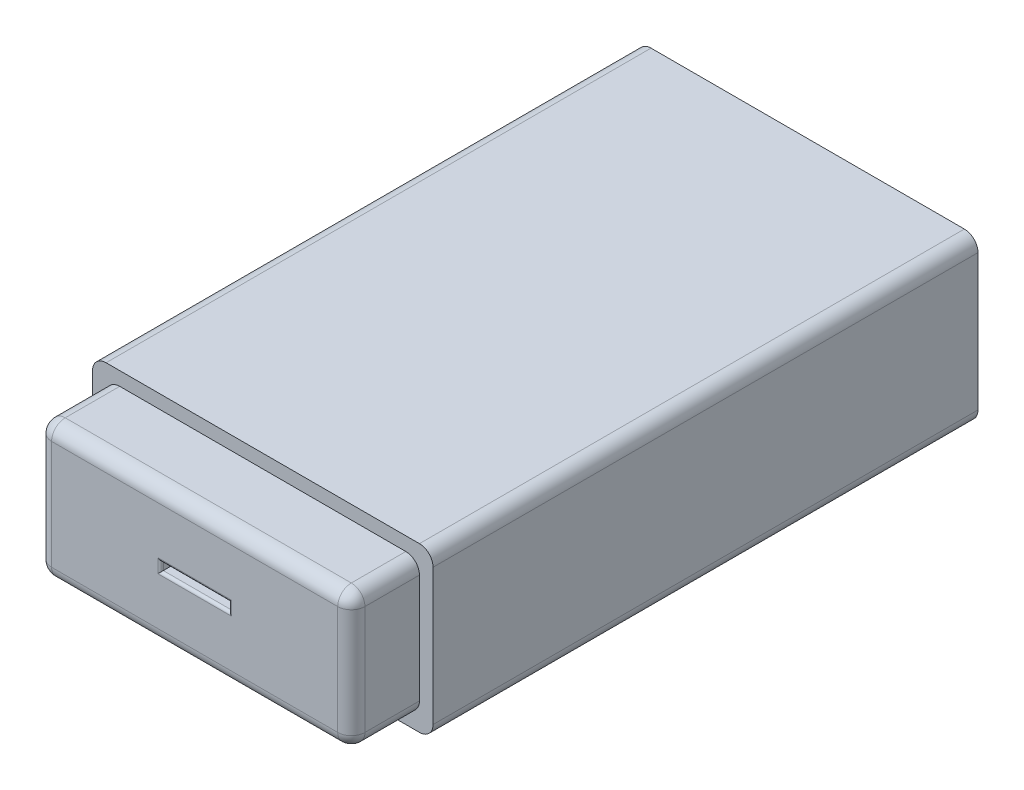
ISO-10303-21;
HEADER;
FILE_DESCRIPTION(('STEP AP214'),'2;1');
FILE_NAME('part.step','',(''),(''),'','','');
FILE_SCHEMA(('AUTOMOTIVE_DESIGN { 1 0 10303 214 1 1 1 1 }'));
ENDSEC;
DATA;
#1=APPLICATION_CONTEXT('core data for automotive mechanical design processes');
#2=APPLICATION_PROTOCOL_DEFINITION('international standard','automotive_design',2000,#1);
#3=PRODUCT_CONTEXT('',#1,'mechanical');
#4=PRODUCT('Part','Part','',(#3));
#5=PRODUCT_RELATED_PRODUCT_CATEGORY('part','',(#4));
#6=PRODUCT_DEFINITION_FORMATION('','',#4);
#7=PRODUCT_DEFINITION_CONTEXT('part definition',#1,'design');
#8=PRODUCT_DEFINITION('design','',#6,#7);
#9=PRODUCT_DEFINITION_SHAPE('','',#8);
#10=(LENGTH_UNIT() NAMED_UNIT(*) SI_UNIT(.MILLI.,.METRE.));
#11=(NAMED_UNIT(*) PLANE_ANGLE_UNIT() SI_UNIT($,.RADIAN.));
#12=(NAMED_UNIT(*) SI_UNIT($,.STERADIAN.) SOLID_ANGLE_UNIT());
#13=UNCERTAINTY_MEASURE_WITH_UNIT(LENGTH_MEASURE(1.E-05),#10,'distance_accuracy_value','');
#14=(GEOMETRIC_REPRESENTATION_CONTEXT(3) GLOBAL_UNCERTAINTY_ASSIGNED_CONTEXT((#13)) GLOBAL_UNIT_ASSIGNED_CONTEXT((#10,
#11,#12)) REPRESENTATION_CONTEXT('',''));
#15=CARTESIAN_POINT('',(0.,0.,0.));
#16=DIRECTION('',(0.,0.,1.));
#17=DIRECTION('',(1.,0.,0.));
#18=AXIS2_PLACEMENT_3D('',#15,#16,#17);
#19=CARTESIAN_POINT('',(-3.429,-0.396875,31.496));
#20=DIRECTION('',(0.,-1.,0.));
#21=DIRECTION('',(0.,0.,-1.));
#22=AXIS2_PLACEMENT_3D('',#19,#20,#21);
#23=CYLINDRICAL_SURFACE('',#22,0.254);
#24=CARTESIAN_POINT('',(-3.175,0.396875,31.496));
#25=CARTESIAN_POINT('',(-3.175,0.396875,31.6447897551572));
#26=CARTESIAN_POINT('',(-3.28021024484277,0.502085244842766,31.75));
#27=CARTESIAN_POINT('',(-3.429,0.650875,31.75));
#28=(BOUNDED_CURVE() B_SPLINE_CURVE(3,(#24,#25,#26,#27),.UNSPECIFIED.,.F.,
.F.) B_SPLINE_CURVE_WITH_KNOTS((4,4),(0.,1.5707963267949),
.UNSPECIFIED.) CURVE() GEOMETRIC_REPRESENTATION_ITEM() RATIONAL_B_SPLINE_CURVE((1.,
0.804737854124365,0.804737854124365,1.)) REPRESENTATION_ITEM(''));
#29=CARTESIAN_POINT('',(-3.175,0.396875,31.496));
#30=VERTEX_POINT('',#29);
#31=CARTESIAN_POINT('',(-3.429,0.650875,31.75));
#32=VERTEX_POINT('',#31);
#33=EDGE_CURVE('E28',#30,#32,#28,.T.);
#34=ORIENTED_EDGE('',*,*,#33,.T.);
#35=DIRECTION('',(0.,1.,0.));
#36=VECTOR('',#35,1.);
#37=CARTESIAN_POINT('',(-3.429,0.,31.75));
#38=LINE('',#37,#36);
#39=CARTESIAN_POINT('',(-3.429,-0.650875,31.75));
#40=VERTEX_POINT('',#39);
#41=EDGE_CURVE('E255',#40,#32,#38,.T.);
#42=ORIENTED_EDGE('',*,*,#41,.F.);
#43=CARTESIAN_POINT('',(-3.429,-0.650875,31.75));
#44=CARTESIAN_POINT('',(-3.28021024484277,-0.502085244842766,31.75));
#45=CARTESIAN_POINT('',(-3.175,-0.396875,31.6447897551572));
#46=CARTESIAN_POINT('',(-3.175,-0.396875,31.496));
#47=(BOUNDED_CURVE() B_SPLINE_CURVE(3,(#43,#44,#45,#46),.UNSPECIFIED.,.F.,
.F.) B_SPLINE_CURVE_WITH_KNOTS((4,4),(1.5707963267949,3.1415926535898),
.UNSPECIFIED.) CURVE() GEOMETRIC_REPRESENTATION_ITEM() RATIONAL_B_SPLINE_CURVE((1.,
0.804737854124365,0.804737854124365,1.)) REPRESENTATION_ITEM(''));
#48=CARTESIAN_POINT('',(-3.175,-0.396875,31.496));
#49=VERTEX_POINT('',#48);
#50=EDGE_CURVE('E11',#40,#49,#47,.T.);
#51=ORIENTED_EDGE('',*,*,#50,.T.);
#52=DIRECTION('',(0.,-1.,0.));
#53=VECTOR('',#52,1.);
#54=CARTESIAN_POINT('',(-3.175,-0.396875,31.496));
#55=LINE('',#54,#53);
#56=EDGE_CURVE('E419',#30,#49,#55,.T.);
#57=ORIENTED_EDGE('',*,*,#56,.F.);
#58=EDGE_LOOP('',(#34,#42,#51,#57));
#59=FACE_BOUND('',#58,.T.);
#60=ADVANCED_FACE('F17',(#59),#23,.T.);
#61=CARTESIAN_POINT('',(-3.175,-0.650875,31.496));
#62=DIRECTION('',(1.,0.,0.));
#63=DIRECTION('',(0.,0.,-1.));
#64=AXIS2_PLACEMENT_3D('',#61,#62,#63);
#65=CYLINDRICAL_SURFACE('',#64,0.254);
#66=CARTESIAN_POINT('',(3.429,-0.650875,31.75));
#67=CARTESIAN_POINT('',(3.28021024484277,-0.502085244842766,31.75));
#68=CARTESIAN_POINT('',(3.175,-0.396875,31.6447897551572));
#69=CARTESIAN_POINT('',(3.175,-0.396875,31.496));
#70=(BOUNDED_CURVE() B_SPLINE_CURVE(3,(#66,#67,#68,#69),.UNSPECIFIED.,.F.,
.F.) B_SPLINE_CURVE_WITH_KNOTS((4,4),(1.5707963267949,3.1415926535898),
.UNSPECIFIED.) CURVE() GEOMETRIC_REPRESENTATION_ITEM() RATIONAL_B_SPLINE_CURVE((1.,
0.804737854124365,0.804737854124365,1.)) REPRESENTATION_ITEM(''));
#71=CARTESIAN_POINT('',(3.429,-0.650875,31.75));
#72=VERTEX_POINT('',#71);
#73=CARTESIAN_POINT('',(3.175,-0.396875,31.496));
#74=VERTEX_POINT('',#73);
#75=EDGE_CURVE('E241',#72,#74,#70,.T.);
#76=ORIENTED_EDGE('',*,*,#75,.T.);
#77=DIRECTION('',(1.,0.,0.));
#78=VECTOR('',#77,1.);
#79=CARTESIAN_POINT('',(-3.175,-0.396875,31.496));
#80=LINE('',#79,#78);
#81=EDGE_CURVE('E329',#49,#74,#80,.T.);
#82=ORIENTED_EDGE('',*,*,#81,.F.);
#83=ORIENTED_EDGE('',*,*,#50,.F.);
#84=DIRECTION('',(-1.,0.,0.));
#85=VECTOR('',#84,1.);
#86=CARTESIAN_POINT('',(0.,-0.650875,31.75));
#87=LINE('',#86,#85);
#88=EDGE_CURVE('E263',#72,#40,#87,.T.);
#89=ORIENTED_EDGE('',*,*,#88,.F.);
#90=EDGE_LOOP('',(#76,#82,#83,#89));
#91=FACE_BOUND('',#90,.T.);
#92=ADVANCED_FACE('F831',(#91),#65,.T.);
#93=CARTESIAN_POINT('',(-3.175,0.650875,31.496));
#94=DIRECTION('',(-1.,0.,0.));
#95=DIRECTION('',(0.,0.,1.));
#96=AXIS2_PLACEMENT_3D('',#93,#94,#95);
#97=CYLINDRICAL_SURFACE('',#96,0.254);
#98=CARTESIAN_POINT('',(3.175,0.396875,31.496));
#99=CARTESIAN_POINT('',(3.175,0.396875,31.6447897551572));
#100=CARTESIAN_POINT('',(3.28021024484277,0.502085244842766,31.75));
#101=CARTESIAN_POINT('',(3.429,0.650875,31.75));
#102=(BOUNDED_CURVE() B_SPLINE_CURVE(3,(#98,#99,#100,#101),.UNSPECIFIED.,.F.,
.F.) B_SPLINE_CURVE_WITH_KNOTS((4,4),(3.1415926535898,4.71238898038469),
.UNSPECIFIED.) CURVE() GEOMETRIC_REPRESENTATION_ITEM() RATIONAL_B_SPLINE_CURVE((1.,
0.804737854124365,0.804737854124365,1.)) REPRESENTATION_ITEM(''));
#103=CARTESIAN_POINT('',(3.175,0.396875,31.496));
#104=VERTEX_POINT('',#103);
#105=CARTESIAN_POINT('',(3.429,0.650875,31.75));
#106=VERTEX_POINT('',#105);
#107=EDGE_CURVE('E231',#104,#106,#102,.T.);
#108=ORIENTED_EDGE('',*,*,#107,.T.);
#109=DIRECTION('',(1.,0.,0.));
#110=VECTOR('',#109,1.);
#111=CARTESIAN_POINT('',(0.,0.650875,31.75));
#112=LINE('',#111,#110);
#113=EDGE_CURVE('E235',#32,#106,#112,.T.);
#114=ORIENTED_EDGE('',*,*,#113,.F.);
#115=ORIENTED_EDGE('',*,*,#33,.F.);
#116=DIRECTION('',(-1.,0.,0.));
#117=VECTOR('',#116,1.);
#118=CARTESIAN_POINT('',(-3.175,0.396875,31.496));
#119=LINE('',#118,#117);
#120=EDGE_CURVE('E237',#104,#30,#119,.T.);
#121=ORIENTED_EDGE('',*,*,#120,.F.);
#122=EDGE_LOOP('',(#108,#114,#115,#121));
#123=FACE_BOUND('',#122,.T.);
#124=ADVANCED_FACE('F233',(#123),#97,.T.);
#125=CARTESIAN_POINT('',(3.429,-0.396875,31.496));
#126=DIRECTION('',(0.,1.,0.));
#127=DIRECTION('',(0.,0.,1.));
#128=AXIS2_PLACEMENT_3D('',#125,#126,#127);
#129=CYLINDRICAL_SURFACE('',#128,0.254);
#130=ORIENTED_EDGE('',*,*,#75,.F.);
#131=DIRECTION('',(0.,-1.,0.));
#132=VECTOR('',#131,1.);
#133=CARTESIAN_POINT('',(3.429,0.,31.75));
#134=LINE('',#133,#132);
#135=EDGE_CURVE('E245',#106,#72,#134,.T.);
#136=ORIENTED_EDGE('',*,*,#135,.F.);
#137=ORIENTED_EDGE('',*,*,#107,.F.);
#138=DIRECTION('',(0.,1.,0.));
#139=VECTOR('',#138,1.);
#140=CARTESIAN_POINT('',(3.175,-0.396875,31.496));
#141=LINE('',#140,#139);
#142=EDGE_CURVE('E389',#74,#104,#141,.T.);
#143=ORIENTED_EDGE('',*,*,#142,.F.);
#144=EDGE_LOOP('',(#130,#136,#137,#143));
#145=FACE_BOUND('',#144,.T.);
#146=ADVANCED_FACE('F246',(#145),#129,.T.);
#147=CARTESIAN_POINT('',(0.,0.,25.4));
#148=DIRECTION('',(0.,0.,-1.));
#149=DIRECTION('',(0.,-1.,0.));
#150=AXIS2_PLACEMENT_3D('',#147,#148,#149);
#151=PLANE('',#150);
#152=DIRECTION('',(0.,1.,0.));
#153=VECTOR('',#152,1.);
#154=CARTESIAN_POINT('',(3.175,-0.396875,25.4));
#155=LINE('',#154,#153);
#156=CARTESIAN_POINT('',(3.175,-0.396875,25.4));
#157=VERTEX_POINT('',#156);
#158=CARTESIAN_POINT('',(3.175,0.396875,25.4));
#159=VERTEX_POINT('',#158);
#160=EDGE_CURVE('E330',#157,#159,#155,.T.);
#161=ORIENTED_EDGE('',*,*,#160,.T.);
#162=DIRECTION('',(-1.,0.,0.));
#163=VECTOR('',#162,1.);
#164=CARTESIAN_POINT('',(-3.175,0.396875,25.4));
#165=LINE('',#164,#163);
#166=CARTESIAN_POINT('',(-3.175,0.396875,25.4));
#167=VERTEX_POINT('',#166);
#168=EDGE_CURVE('E168',#159,#167,#165,.T.);
#169=ORIENTED_EDGE('',*,*,#168,.T.);
#170=DIRECTION('',(0.,-1.,0.));
#171=VECTOR('',#170,1.);
#172=CARTESIAN_POINT('',(-3.175,-0.396875,25.4));
#173=LINE('',#172,#171);
#174=CARTESIAN_POINT('',(-3.175,-0.396875,25.4));
#175=VERTEX_POINT('',#174);
#176=EDGE_CURVE('E156',#167,#175,#173,.T.);
#177=ORIENTED_EDGE('',*,*,#176,.T.);
#178=DIRECTION('',(1.,0.,0.));
#179=VECTOR('',#178,1.);
#180=CARTESIAN_POINT('',(-3.175,-0.396875,25.4));
#181=LINE('',#180,#179);
#182=EDGE_CURVE('E436',#175,#157,#181,.T.);
#183=ORIENTED_EDGE('',*,*,#182,.T.);
#184=EDGE_LOOP('',(#161,#169,#177,#183));
#185=FACE_BOUND('',#184,.T.);
#186=ADVANCED_FACE('F811',(#185),#151,.F.);
#187=CARTESIAN_POINT('',(-3.175,0.396875,25.4));
#188=DIRECTION('',(0.,1.,0.));
#189=DIRECTION('',(1.,0.,0.));
#190=AXIS2_PLACEMENT_3D('',#187,#188,#189);
#191=PLANE('',#190);
#192=DIRECTION('',(0.,0.,1.));
#193=VECTOR('',#192,1.);
#194=CARTESIAN_POINT('',(3.175,0.396875,25.4));
#195=LINE('',#194,#193);
#196=EDGE_CURVE('E393',#159,#104,#195,.T.);
#197=ORIENTED_EDGE('',*,*,#196,.T.);
#198=ORIENTED_EDGE('',*,*,#120,.T.);
#199=DIRECTION('',(0.,0.,1.));
#200=VECTOR('',#199,1.);
#201=CARTESIAN_POINT('',(-3.175,0.396875,25.4));
#202=LINE('',#201,#200);
#203=EDGE_CURVE('E433',#167,#30,#202,.T.);
#204=ORIENTED_EDGE('',*,*,#203,.F.);
#205=ORIENTED_EDGE('',*,*,#168,.F.);
#206=EDGE_LOOP('',(#197,#198,#204,#205));
#207=FACE_BOUND('',#206,.T.);
#208=ADVANCED_FACE('F815',(#207),#191,.F.);
#209=CARTESIAN_POINT('',(-3.175,-0.396875,25.4));
#210=DIRECTION('',(-1.,0.,0.));
#211=DIRECTION('',(0.,0.,1.));
#212=AXIS2_PLACEMENT_3D('',#209,#210,#211);
#213=PLANE('',#212);
#214=ORIENTED_EDGE('',*,*,#203,.T.);
#215=ORIENTED_EDGE('',*,*,#56,.T.);
#216=DIRECTION('',(0.,0.,1.));
#217=VECTOR('',#216,1.);
#218=CARTESIAN_POINT('',(-3.175,-0.396875,25.4));
#219=LINE('',#218,#217);
#220=EDGE_CURVE('E325',#175,#49,#219,.T.);
#221=ORIENTED_EDGE('',*,*,#220,.F.);
#222=ORIENTED_EDGE('',*,*,#176,.F.);
#223=EDGE_LOOP('',(#214,#215,#221,#222));
#224=FACE_BOUND('',#223,.T.);
#225=ADVANCED_FACE('F881',(#224),#213,.F.);
#226=CARTESIAN_POINT('',(-3.175,-0.396875,25.4));
#227=DIRECTION('',(0.,-1.,0.));
#228=DIRECTION('',(0.,0.,-1.));
#229=AXIS2_PLACEMENT_3D('',#226,#227,#228);
#230=PLANE('',#229);
#231=ORIENTED_EDGE('',*,*,#220,.T.);
#232=ORIENTED_EDGE('',*,*,#81,.T.);
#233=DIRECTION('',(0.,0.,1.));
#234=VECTOR('',#233,1.);
#235=CARTESIAN_POINT('',(3.175,-0.396875,25.4));
#236=LINE('',#235,#234);
#237=EDGE_CURVE('E293',#157,#74,#236,.T.);
#238=ORIENTED_EDGE('',*,*,#237,.F.);
#239=ORIENTED_EDGE('',*,*,#182,.F.);
#240=EDGE_LOOP('',(#231,#232,#238,#239));
#241=FACE_BOUND('',#240,.T.);
#242=ADVANCED_FACE('F915',(#241),#230,.F.);
#243=CARTESIAN_POINT('',(3.175,-0.396875,25.4));
#244=DIRECTION('',(1.,0.,0.));
#245=DIRECTION('',(0.,1.,0.));
#246=AXIS2_PLACEMENT_3D('',#243,#244,#245);
#247=PLANE('',#246);
#248=ORIENTED_EDGE('',*,*,#237,.T.);
#249=ORIENTED_EDGE('',*,*,#142,.T.);
#250=ORIENTED_EDGE('',*,*,#196,.F.);
#251=ORIENTED_EDGE('',*,*,#160,.F.);
#252=EDGE_LOOP('',(#248,#249,#250,#251));
#253=FACE_BOUND('',#252,.T.);
#254=ADVANCED_FACE('F898',(#253),#247,.F.);
#255=CARTESIAN_POINT('',(-14.605,-6.35,-25.4));
#256=DIRECTION('',(0.,0.,1.));
#257=DIRECTION('',(1.,0.,0.));
#258=AXIS2_PLACEMENT_3D('',#255,#256,#257);
#259=CYLINDRICAL_SURFACE('',#258,1.27);
#260=CARTESIAN_POINT('',(-14.605,-6.35,-25.4));
#261=DIRECTION('',(0.,0.,-1.));
#262=DIRECTION('',(-1.,0.,0.));
#263=AXIS2_PLACEMENT_3D('',#260,#261,#262);
#264=CIRCLE('',#263,1.27);
#265=CARTESIAN_POINT('',(-14.605,-7.62,-25.4));
#266=VERTEX_POINT('',#265);
#267=CARTESIAN_POINT('',(-15.875,-6.35,-25.4));
#268=VERTEX_POINT('',#267);
#269=EDGE_CURVE('E303',#266,#268,#264,.T.);
#270=ORIENTED_EDGE('',*,*,#269,.F.);
#271=DIRECTION('',(0.,0.,-1.));
#272=VECTOR('',#271,1.);
#273=CARTESIAN_POINT('',(-14.605,-7.62,-25.4));
#274=LINE('',#273,#272);
#275=CARTESIAN_POINT('',(-14.605,-7.62,25.4));
#276=VERTEX_POINT('',#275);
#277=EDGE_CURVE('E377',#276,#266,#274,.T.);
#278=ORIENTED_EDGE('',*,*,#277,.F.);
#279=CARTESIAN_POINT('',(-14.605,-6.35,25.4));
#280=DIRECTION('',(0.,0.,1.));
#281=DIRECTION('',(-1.,0.,0.));
#282=AXIS2_PLACEMENT_3D('',#279,#280,#281);
#283=CIRCLE('',#282,1.27);
#284=CARTESIAN_POINT('',(-15.875,-6.35,25.4));
#285=VERTEX_POINT('',#284);
#286=EDGE_CURVE('E269',#285,#276,#283,.T.);
#287=ORIENTED_EDGE('',*,*,#286,.F.);
#288=DIRECTION('',(0.,0.,1.));
#289=VECTOR('',#288,1.);
#290=CARTESIAN_POINT('',(-15.875,-6.35,-25.4));
#291=LINE('',#290,#289);
#292=EDGE_CURVE('E274',#268,#285,#291,.T.);
#293=ORIENTED_EDGE('',*,*,#292,.F.);
#294=EDGE_LOOP('',(#270,#278,#287,#293));
#295=FACE_BOUND('',#294,.T.);
#296=ADVANCED_FACE('F780',(#295),#259,.T.);
#297=CARTESIAN_POINT('',(-14.605,6.35,-25.4));
#298=DIRECTION('',(0.,0.,1.));
#299=DIRECTION('',(1.,0.,0.));
#300=AXIS2_PLACEMENT_3D('',#297,#298,#299);
#301=CYLINDRICAL_SURFACE('',#300,1.27);
#302=CARTESIAN_POINT('',(-14.605,6.35,-25.4));
#303=DIRECTION('',(0.,0.,-1.));
#304=DIRECTION('',(-1.,0.,0.));
#305=AXIS2_PLACEMENT_3D('',#302,#303,#304);
#306=CIRCLE('',#305,1.27);
#307=CARTESIAN_POINT('',(-15.875,6.35,-25.4));
#308=VERTEX_POINT('',#307);
#309=CARTESIAN_POINT('',(-14.605,7.62,-25.4));
#310=VERTEX_POINT('',#309);
#311=EDGE_CURVE('E299',#308,#310,#306,.T.);
#312=ORIENTED_EDGE('',*,*,#311,.F.);
#313=DIRECTION('',(0.,0.,-1.));
#314=VECTOR('',#313,1.);
#315=CARTESIAN_POINT('',(-15.875,6.35,-25.4));
#316=LINE('',#315,#314);
#317=CARTESIAN_POINT('',(-15.875,6.35,25.4));
#318=VERTEX_POINT('',#317);
#319=EDGE_CURVE('E381',#318,#308,#316,.T.);
#320=ORIENTED_EDGE('',*,*,#319,.F.);
#321=CARTESIAN_POINT('',(-14.605,6.35,25.4));
#322=DIRECTION('',(0.,0.,1.));
#323=DIRECTION('',(-1.,0.,0.));
#324=AXIS2_PLACEMENT_3D('',#321,#322,#323);
#325=CIRCLE('',#324,1.27);
#326=CARTESIAN_POINT('',(-14.605,7.62,25.4));
#327=VERTEX_POINT('',#326);
#328=EDGE_CURVE('E505',#327,#318,#325,.T.);
#329=ORIENTED_EDGE('',*,*,#328,.F.);
#330=DIRECTION('',(0.,0.,1.));
#331=VECTOR('',#330,1.);
#332=CARTESIAN_POINT('',(-14.605,7.62,-25.4));
#333=LINE('',#332,#331);
#334=EDGE_CURVE('E383',#310,#327,#333,.T.);
#335=ORIENTED_EDGE('',*,*,#334,.F.);
#336=EDGE_LOOP('',(#312,#320,#329,#335));
#337=FACE_BOUND('',#336,.T.);
#338=ADVANCED_FACE('F776',(#337),#301,.T.);
#339=CARTESIAN_POINT('',(14.605,6.35,-25.4));
#340=DIRECTION('',(0.,0.,1.));
#341=DIRECTION('',(1.,0.,0.));
#342=AXIS2_PLACEMENT_3D('',#339,#340,#341);
#343=CYLINDRICAL_SURFACE('',#342,1.27);
#344=CARTESIAN_POINT('',(14.605,6.35,-25.4));
#345=DIRECTION('',(0.,0.,-1.));
#346=DIRECTION('',(-1.,0.,0.));
#347=AXIS2_PLACEMENT_3D('',#344,#345,#346);
#348=CIRCLE('',#347,1.27);
#349=CARTESIAN_POINT('',(14.605,7.62,-25.4));
#350=VERTEX_POINT('',#349);
#351=CARTESIAN_POINT('',(15.875,6.35,-25.4));
#352=VERTEX_POINT('',#351);
#353=EDGE_CURVE('E21',#350,#352,#348,.T.);
#354=ORIENTED_EDGE('',*,*,#353,.F.);
#355=DIRECTION('',(0.,0.,-1.));
#356=VECTOR('',#355,1.);
#357=CARTESIAN_POINT('',(14.605,7.62,-25.4));
#358=LINE('',#357,#356);
#359=CARTESIAN_POINT('',(14.605,7.62,25.4));
#360=VERTEX_POINT('',#359);
#361=EDGE_CURVE('E277',#360,#350,#358,.T.);
#362=ORIENTED_EDGE('',*,*,#361,.F.);
#363=CARTESIAN_POINT('',(14.605,6.35,25.4));
#364=DIRECTION('',(0.,0.,1.));
#365=DIRECTION('',(-1.,0.,0.));
#366=AXIS2_PLACEMENT_3D('',#363,#364,#365);
#367=CIRCLE('',#366,1.27);
#368=CARTESIAN_POINT('',(15.875,6.35,25.4));
#369=VERTEX_POINT('',#368);
#370=EDGE_CURVE('E424',#369,#360,#367,.T.);
#371=ORIENTED_EDGE('',*,*,#370,.F.);
#372=DIRECTION('',(0.,0.,1.));
#373=VECTOR('',#372,1.);
#374=CARTESIAN_POINT('',(15.875,6.35,-25.4));
#375=LINE('',#374,#373);
#376=EDGE_CURVE('E279',#352,#369,#375,.T.);
#377=ORIENTED_EDGE('',*,*,#376,.F.);
#378=EDGE_LOOP('',(#354,#362,#371,#377));
#379=FACE_BOUND('',#378,.T.);
#380=ADVANCED_FACE('F755',(#379),#343,.T.);
#381=CARTESIAN_POINT('',(14.605,-6.35,-25.4));
#382=DIRECTION('',(0.,0.,1.));
#383=DIRECTION('',(1.,0.,0.));
#384=AXIS2_PLACEMENT_3D('',#381,#382,#383);
#385=CYLINDRICAL_SURFACE('',#384,1.27);
#386=CARTESIAN_POINT('',(14.605,-6.35,-25.4));
#387=DIRECTION('',(0.,0.,-1.));
#388=DIRECTION('',(-1.,0.,0.));
#389=AXIS2_PLACEMENT_3D('',#386,#387,#388);
#390=CIRCLE('',#389,1.27);
#391=CARTESIAN_POINT('',(15.875,-6.35,-25.4));
#392=VERTEX_POINT('',#391);
#393=CARTESIAN_POINT('',(14.605,-7.62,-25.4));
#394=VERTEX_POINT('',#393);
#395=EDGE_CURVE('E386',#392,#394,#390,.T.);
#396=ORIENTED_EDGE('',*,*,#395,.F.);
#397=DIRECTION('',(0.,0.,-1.));
#398=VECTOR('',#397,1.);
#399=CARTESIAN_POINT('',(15.875,-6.35,-25.4));
#400=LINE('',#399,#398);
#401=CARTESIAN_POINT('',(15.875,-6.35,25.4));
#402=VERTEX_POINT('',#401);
#403=EDGE_CURVE('E344',#402,#392,#400,.T.);
#404=ORIENTED_EDGE('',*,*,#403,.F.);
#405=CARTESIAN_POINT('',(14.605,-6.35,25.4));
#406=DIRECTION('',(0.,0.,1.));
#407=DIRECTION('',(-1.,0.,0.));
#408=AXIS2_PLACEMENT_3D('',#405,#406,#407);
#409=CIRCLE('',#408,1.27);
#410=CARTESIAN_POINT('',(14.605,-7.62,25.4));
#411=VERTEX_POINT('',#410);
#412=EDGE_CURVE('E425',#411,#402,#409,.T.);
#413=ORIENTED_EDGE('',*,*,#412,.F.);
#414=DIRECTION('',(0.,0.,1.));
#415=VECTOR('',#414,1.);
#416=CARTESIAN_POINT('',(14.605,-7.62,-25.4));
#417=LINE('',#416,#415);
#418=EDGE_CURVE('E382',#394,#411,#417,.T.);
#419=ORIENTED_EDGE('',*,*,#418,.F.);
#420=EDGE_LOOP('',(#396,#404,#413,#419));
#421=FACE_BOUND('',#420,.T.);
#422=ADVANCED_FACE('F751',(#421),#385,.T.);
#423=CARTESIAN_POINT('',(0.,-5.08,30.48));
#424=DIRECTION('',(1.,0.,0.));
#425=DIRECTION('',(0.,0.,-1.));
#426=AXIS2_PLACEMENT_3D('',#423,#424,#425);
#427=CYLINDRICAL_SURFACE('',#426,1.27);
#428=CARTESIAN_POINT('',(-13.335,-5.08,30.48));
#429=DIRECTION('',(1.,0.,0.));
#430=DIRECTION('',(0.,0.,1.));
#431=AXIS2_PLACEMENT_3D('',#428,#429,#430);
#432=CIRCLE('',#431,1.27);
#433=CARTESIAN_POINT('',(-13.335,-5.08,31.75));
#434=VERTEX_POINT('',#433);
#435=CARTESIAN_POINT('',(-13.335,-6.35,30.48));
#436=VERTEX_POINT('',#435);
#437=EDGE_CURVE('E294',#434,#436,#432,.T.);
#438=ORIENTED_EDGE('',*,*,#437,.T.);
#439=DIRECTION('',(-1.,0.,0.));
#440=VECTOR('',#439,1.);
#441=CARTESIAN_POINT('',(-14.605,-6.35,30.48));
#442=LINE('',#441,#440);
#443=CARTESIAN_POINT('',(13.335,-6.35,30.48));
#444=VERTEX_POINT('',#443);
#445=EDGE_CURVE('E463',#444,#436,#442,.T.);
#446=ORIENTED_EDGE('',*,*,#445,.F.);
#447=CARTESIAN_POINT('',(13.335,-5.08,30.48));
#448=DIRECTION('',(-1.,0.,0.));
#449=DIRECTION('',(0.,0.,-1.));
#450=AXIS2_PLACEMENT_3D('',#447,#448,#449);
#451=CIRCLE('',#450,1.27);
#452=CARTESIAN_POINT('',(13.335,-5.08,31.75));
#453=VERTEX_POINT('',#452);
#454=EDGE_CURVE('E290',#444,#453,#451,.T.);
#455=ORIENTED_EDGE('',*,*,#454,.T.);
#456=DIRECTION('',(1.,0.,0.));
#457=VECTOR('',#456,1.);
#458=CARTESIAN_POINT('',(0.,-5.08,31.75));
#459=LINE('',#458,#457);
#460=EDGE_CURVE('E309',#434,#453,#459,.T.);
#461=ORIENTED_EDGE('',*,*,#460,.F.);
#462=EDGE_LOOP('',(#438,#446,#455,#461));
#463=FACE_BOUND('',#462,.T.);
#464=ADVANCED_FACE('F563',(#463),#427,.T.);
#465=CARTESIAN_POINT('',(13.335,-5.08,30.48));
#466=DIRECTION('',(0.,1.,0.));
#467=DIRECTION('',(0.,0.,-1.));
#468=AXIS2_PLACEMENT_3D('',#465,#466,#467);
#469=SPHERICAL_SURFACE('',#468,1.27);
#470=CARTESIAN_POINT('',(13.335,-5.08,30.48));
#471=DIRECTION('',(0.,0.,1.));
#472=DIRECTION('',(1.,0.,0.));
#473=AXIS2_PLACEMENT_3D('',#470,#471,#472);
#474=CIRCLE('',#473,1.27);
#475=CARTESIAN_POINT('',(14.605,-5.08,30.48));
#476=VERTEX_POINT('',#475);
#477=EDGE_CURVE('E319',#444,#476,#474,.T.);
#478=ORIENTED_EDGE('',*,*,#477,.T.);
#479=CARTESIAN_POINT('',(13.335,-5.08,30.48));
#480=DIRECTION('',(0.,-1.,0.));
#481=DIRECTION('',(0.,0.,-1.));
#482=AXIS2_PLACEMENT_3D('',#479,#480,#481);
#483=CIRCLE('',#482,1.27);
#484=EDGE_CURVE('E357',#476,#453,#483,.T.);
#485=ORIENTED_EDGE('',*,*,#484,.T.);
#486=ORIENTED_EDGE('',*,*,#454,.F.);
#487=EDGE_LOOP('',(#478,#485,#486));
#488=FACE_BOUND('',#487,.T.);
#489=ADVANCED_FACE('F555',(#488),#469,.T.);
#490=CARTESIAN_POINT('',(-13.335,-5.08,30.48));
#491=DIRECTION('',(0.,1.,0.));
#492=DIRECTION('',(0.,0.,1.));
#493=AXIS2_PLACEMENT_3D('',#490,#491,#492);
#494=SPHERICAL_SURFACE('',#493,1.27);
#495=CARTESIAN_POINT('',(-13.335,-5.08,30.48));
#496=DIRECTION('',(0.,-1.,0.));
#497=DIRECTION('',(0.,0.,-1.));
#498=AXIS2_PLACEMENT_3D('',#495,#496,#497);
#499=CIRCLE('',#498,1.27);
#500=CARTESIAN_POINT('',(-14.605,-5.08,30.48));
#501=VERTEX_POINT('',#500);
#502=EDGE_CURVE('E354',#434,#501,#499,.T.);
#503=ORIENTED_EDGE('',*,*,#502,.T.);
#504=CARTESIAN_POINT('',(-13.335,-5.08,30.48));
#505=DIRECTION('',(0.,0.,1.));
#506=DIRECTION('',(1.,0.,0.));
#507=AXIS2_PLACEMENT_3D('',#504,#505,#506);
#508=CIRCLE('',#507,1.27);
#509=EDGE_CURVE('E358',#501,#436,#508,.T.);
#510=ORIENTED_EDGE('',*,*,#509,.T.);
#511=ORIENTED_EDGE('',*,*,#437,.F.);
#512=EDGE_LOOP('',(#503,#510,#511));
#513=FACE_BOUND('',#512,.T.);
#514=ADVANCED_FACE('F742',(#513),#494,.T.);
#515=CARTESIAN_POINT('',(13.335,-5.08,31.75));
#516=DIRECTION('',(0.,0.,-1.));
#517=DIRECTION('',(-1.,0.,0.));
#518=AXIS2_PLACEMENT_3D('',#515,#516,#517);
#519=CYLINDRICAL_SURFACE('',#518,1.27);
#520=CARTESIAN_POINT('',(13.335,-5.08,25.4));
#521=DIRECTION('',(0.,0.,-1.));
#522=DIRECTION('',(-1.,0.,0.));
#523=AXIS2_PLACEMENT_3D('',#520,#521,#522);
#524=CIRCLE('',#523,1.27);
#525=CARTESIAN_POINT('',(14.605,-5.08,25.4));
#526=VERTEX_POINT('',#525);
#527=CARTESIAN_POINT('',(13.335,-6.35,25.4));
#528=VERTEX_POINT('',#527);
#529=EDGE_CURVE('E343',#526,#528,#524,.T.);
#530=ORIENTED_EDGE('',*,*,#529,.F.);
#531=DIRECTION('',(0.,0.,-1.));
#532=VECTOR('',#531,1.);
#533=CARTESIAN_POINT('',(14.605,-5.08,31.75));
#534=LINE('',#533,#532);
#535=EDGE_CURVE('E353',#476,#526,#534,.T.);
#536=ORIENTED_EDGE('',*,*,#535,.F.);
#537=ORIENTED_EDGE('',*,*,#477,.F.);
#538=DIRECTION('',(0.,0.,1.));
#539=VECTOR('',#538,1.);
#540=CARTESIAN_POINT('',(13.335,-6.35,31.75));
#541=LINE('',#540,#539);
#542=EDGE_CURVE('E324',#528,#444,#541,.T.);
#543=ORIENTED_EDGE('',*,*,#542,.F.);
#544=EDGE_LOOP('',(#530,#536,#537,#543));
#545=FACE_BOUND('',#544,.T.);
#546=ADVANCED_FACE('F551',(#545),#519,.T.);
#547=CARTESIAN_POINT('',(13.335,0.,30.48));
#548=DIRECTION('',(0.,1.,0.));
#549=DIRECTION('',(0.,0.,1.));
#550=AXIS2_PLACEMENT_3D('',#547,#548,#549);
#551=CYLINDRICAL_SURFACE('',#550,1.27);
#552=CARTESIAN_POINT('',(13.335,5.08,30.48));
#553=DIRECTION('',(0.,-1.,0.));
#554=DIRECTION('',(0.,0.,1.));
#555=AXIS2_PLACEMENT_3D('',#552,#553,#554);
#556=CIRCLE('',#555,1.27);
#557=CARTESIAN_POINT('',(14.605,5.08,30.48));
#558=VERTEX_POINT('',#557);
#559=CARTESIAN_POINT('',(13.335,5.08,31.75));
#560=VERTEX_POINT('',#559);
#561=EDGE_CURVE('E316',#558,#560,#556,.T.);
#562=ORIENTED_EDGE('',*,*,#561,.T.);
#563=DIRECTION('',(0.,1.,0.));
#564=VECTOR('',#563,1.);
#565=CARTESIAN_POINT('',(13.335,0.,31.75));
#566=LINE('',#565,#564);
#567=EDGE_CURVE('E304',#453,#560,#566,.T.);
#568=ORIENTED_EDGE('',*,*,#567,.F.);
#569=ORIENTED_EDGE('',*,*,#484,.F.);
#570=DIRECTION('',(0.,-1.,0.));
#571=VECTOR('',#570,1.);
#572=CARTESIAN_POINT('',(14.605,-6.35,30.48));
#573=LINE('',#572,#571);
#574=EDGE_CURVE('E349',#558,#476,#573,.T.);
#575=ORIENTED_EDGE('',*,*,#574,.F.);
#576=EDGE_LOOP('',(#562,#568,#569,#575));
#577=FACE_BOUND('',#576,.T.);
#578=ADVANCED_FACE('F559',(#577),#551,.T.);
#579=CARTESIAN_POINT('',(-13.335,0.,30.48));
#580=DIRECTION('',(0.,-1.,0.));
#581=DIRECTION('',(0.,0.,-1.));
#582=AXIS2_PLACEMENT_3D('',#579,#580,#581);
#583=CYLINDRICAL_SURFACE('',#582,1.27);
#584=CARTESIAN_POINT('',(-13.335,5.08,30.48));
#585=DIRECTION('',(0.,-1.,0.));
#586=DIRECTION('',(0.,0.,1.));
#587=AXIS2_PLACEMENT_3D('',#584,#585,#586);
#588=CIRCLE('',#587,1.27);
#589=CARTESIAN_POINT('',(-13.335,5.08,31.75));
#590=VERTEX_POINT('',#589);
#591=CARTESIAN_POINT('',(-14.605,5.08,30.48));
#592=VERTEX_POINT('',#591);
#593=EDGE_CURVE('E313',#590,#592,#588,.T.);
#594=ORIENTED_EDGE('',*,*,#593,.T.);
#595=DIRECTION('',(0.,1.,0.));
#596=VECTOR('',#595,1.);
#597=CARTESIAN_POINT('',(-14.605,-6.35,30.48));
#598=LINE('',#597,#596);
#599=EDGE_CURVE('E288',#501,#592,#598,.T.);
#600=ORIENTED_EDGE('',*,*,#599,.F.);
#601=ORIENTED_EDGE('',*,*,#502,.F.);
#602=DIRECTION('',(0.,-1.,0.));
#603=VECTOR('',#602,1.);
#604=CARTESIAN_POINT('',(-13.335,0.,31.75));
#605=LINE('',#604,#603);
#606=EDGE_CURVE('E320',#590,#434,#605,.T.);
#607=ORIENTED_EDGE('',*,*,#606,.F.);
#608=EDGE_LOOP('',(#594,#600,#601,#607));
#609=FACE_BOUND('',#608,.T.);
#610=ADVANCED_FACE('F806',(#609),#583,.T.);
#611=CARTESIAN_POINT('',(-13.335,-5.08,31.75));
#612=DIRECTION('',(0.,0.,-1.));
#613=DIRECTION('',(-1.,0.,0.));
#614=AXIS2_PLACEMENT_3D('',#611,#612,#613);
#615=CYLINDRICAL_SURFACE('',#614,1.27);
#616=CARTESIAN_POINT('',(-13.335,-5.08,25.4));
#617=DIRECTION('',(0.,0.,-1.));
#618=DIRECTION('',(-1.,0.,0.));
#619=AXIS2_PLACEMENT_3D('',#616,#617,#618);
#620=CIRCLE('',#619,1.27);
#621=CARTESIAN_POINT('',(-13.335,-6.35,25.4));
#622=VERTEX_POINT('',#621);
#623=CARTESIAN_POINT('',(-14.605,-5.08,25.4));
#624=VERTEX_POINT('',#623);
#625=EDGE_CURVE('E478',#622,#624,#620,.T.);
#626=ORIENTED_EDGE('',*,*,#625,.F.);
#627=DIRECTION('',(0.,0.,-1.));
#628=VECTOR('',#627,1.);
#629=CARTESIAN_POINT('',(-13.335,-6.35,31.75));
#630=LINE('',#629,#628);
#631=EDGE_CURVE('E267',#436,#622,#630,.T.);
#632=ORIENTED_EDGE('',*,*,#631,.F.);
#633=ORIENTED_EDGE('',*,*,#509,.F.);
#634=DIRECTION('',(0.,0.,1.));
#635=VECTOR('',#634,1.);
#636=CARTESIAN_POINT('',(-14.605,-5.08,31.75));
#637=LINE('',#636,#635);
#638=EDGE_CURVE('E284',#624,#501,#637,.T.);
#639=ORIENTED_EDGE('',*,*,#638,.F.);
#640=EDGE_LOOP('',(#626,#632,#633,#639));
#641=FACE_BOUND('',#640,.T.);
#642=ADVANCED_FACE('F798',(#641),#615,.T.);
#643=CARTESIAN_POINT('',(13.335,5.08,30.48));
#644=DIRECTION('',(1.,0.,0.));
#645=DIRECTION('',(0.,0.,1.));
#646=AXIS2_PLACEMENT_3D('',#643,#644,#645);
#647=SPHERICAL_SURFACE('',#646,1.27);
#648=CARTESIAN_POINT('',(13.335,5.08,30.48));
#649=DIRECTION('',(0.,0.,1.));
#650=DIRECTION('',(1.,0.,0.));
#651=AXIS2_PLACEMENT_3D('',#648,#649,#650);
#652=CIRCLE('',#651,1.27);
#653=CARTESIAN_POINT('',(13.335,6.35,30.48));
#654=VERTEX_POINT('',#653);
#655=EDGE_CURVE('E204',#558,#654,#652,.T.);
#656=ORIENTED_EDGE('',*,*,#655,.T.);
#657=CARTESIAN_POINT('',(13.335,5.08,30.48));
#658=DIRECTION('',(1.,0.,0.));
#659=DIRECTION('',(0.,0.,-1.));
#660=AXIS2_PLACEMENT_3D('',#657,#658,#659);
#661=CIRCLE('',#660,1.27);
#662=EDGE_CURVE('E312',#654,#560,#661,.T.);
#663=ORIENTED_EDGE('',*,*,#662,.T.);
#664=ORIENTED_EDGE('',*,*,#561,.F.);
#665=EDGE_LOOP('',(#656,#663,#664));
#666=FACE_BOUND('',#665,.T.);
#667=ADVANCED_FACE('F793',(#666),#647,.T.);
#668=CARTESIAN_POINT('',(-13.335,5.08,30.48));
#669=DIRECTION('',(1.,0.,0.));
#670=DIRECTION('',(0.,0.,1.));
#671=AXIS2_PLACEMENT_3D('',#668,#669,#670);
#672=SPHERICAL_SURFACE('',#671,1.27);
#673=CARTESIAN_POINT('',(-13.335,5.08,30.48));
#674=DIRECTION('',(-1.,0.,0.));
#675=DIRECTION('',(0.,0.,1.));
#676=AXIS2_PLACEMENT_3D('',#673,#674,#675);
#677=CIRCLE('',#676,1.27);
#678=CARTESIAN_POINT('',(-13.335,6.35,30.48));
#679=VERTEX_POINT('',#678);
#680=EDGE_CURVE('E192',#590,#679,#677,.T.);
#681=ORIENTED_EDGE('',*,*,#680,.T.);
#682=CARTESIAN_POINT('',(-13.335,5.08,30.48));
#683=DIRECTION('',(0.,0.,1.));
#684=DIRECTION('',(1.,0.,0.));
#685=AXIS2_PLACEMENT_3D('',#682,#683,#684);
#686=CIRCLE('',#685,1.27);
#687=EDGE_CURVE('E251',#679,#592,#686,.T.);
#688=ORIENTED_EDGE('',*,*,#687,.T.);
#689=ORIENTED_EDGE('',*,*,#593,.F.);
#690=EDGE_LOOP('',(#681,#688,#689));
#691=FACE_BOUND('',#690,.T.);
#692=ADVANCED_FACE('F797',(#691),#672,.T.);
#693=CARTESIAN_POINT('',(13.335,5.08,31.75));
#694=DIRECTION('',(0.,0.,-1.));
#695=DIRECTION('',(-1.,0.,0.));
#696=AXIS2_PLACEMENT_3D('',#693,#694,#695);
#697=CYLINDRICAL_SURFACE('',#696,1.27);
#698=CARTESIAN_POINT('',(13.335,5.08,25.4));
#699=DIRECTION('',(0.,0.,-1.));
#700=DIRECTION('',(-1.,0.,0.));
#701=AXIS2_PLACEMENT_3D('',#698,#699,#700);
#702=CIRCLE('',#701,1.27);
#703=CARTESIAN_POINT('',(13.335,6.35,25.4));
#704=VERTEX_POINT('',#703);
#705=CARTESIAN_POINT('',(14.605,5.08,25.4));
#706=VERTEX_POINT('',#705);
#707=EDGE_CURVE('E348',#704,#706,#702,.T.);
#708=ORIENTED_EDGE('',*,*,#707,.F.);
#709=DIRECTION('',(0.,0.,-1.));
#710=VECTOR('',#709,1.);
#711=CARTESIAN_POINT('',(13.335,6.35,31.75));
#712=LINE('',#711,#710);
#713=EDGE_CURVE('E361',#654,#704,#712,.T.);
#714=ORIENTED_EDGE('',*,*,#713,.F.);
#715=ORIENTED_EDGE('',*,*,#655,.F.);
#716=DIRECTION('',(0.,0.,1.));
#717=VECTOR('',#716,1.);
#718=CARTESIAN_POINT('',(14.605,5.08,31.75));
#719=LINE('',#718,#717);
#720=EDGE_CURVE('E428',#706,#558,#719,.T.);
#721=ORIENTED_EDGE('',*,*,#720,.F.);
#722=EDGE_LOOP('',(#708,#714,#715,#721));
#723=FACE_BOUND('',#722,.T.);
#724=ADVANCED_FACE('F889',(#723),#697,.T.);
#725=CARTESIAN_POINT('',(0.,5.08,30.48));
#726=DIRECTION('',(-1.,0.,0.));
#727=DIRECTION('',(0.,0.,1.));
#728=AXIS2_PLACEMENT_3D('',#725,#726,#727);
#729=CYLINDRICAL_SURFACE('',#728,1.27);
#730=ORIENTED_EDGE('',*,*,#662,.F.);
#731=DIRECTION('',(1.,0.,0.));
#732=VECTOR('',#731,1.);
#733=CARTESIAN_POINT('',(-14.605,6.35,30.48));
#734=LINE('',#733,#732);
#735=EDGE_CURVE('E365',#679,#654,#734,.T.);
#736=ORIENTED_EDGE('',*,*,#735,.F.);
#737=ORIENTED_EDGE('',*,*,#680,.F.);
#738=DIRECTION('',(-1.,0.,0.));
#739=VECTOR('',#738,1.);
#740=CARTESIAN_POINT('',(0.,5.08,31.75));
#741=LINE('',#740,#739);
#742=EDGE_CURVE('E308',#560,#590,#741,.T.);
#743=ORIENTED_EDGE('',*,*,#742,.F.);
#744=EDGE_LOOP('',(#730,#736,#737,#743));
#745=FACE_BOUND('',#744,.T.);
#746=ADVANCED_FACE('F736',(#745),#729,.T.);
#747=CARTESIAN_POINT('',(-13.335,5.08,31.75));
#748=DIRECTION('',(0.,0.,-1.));
#749=DIRECTION('',(-1.,0.,0.));
#750=AXIS2_PLACEMENT_3D('',#747,#748,#749);
#751=CYLINDRICAL_SURFACE('',#750,1.27);
#752=CARTESIAN_POINT('',(-13.335,5.08,25.4));
#753=DIRECTION('',(0.,0.,-1.));
#754=DIRECTION('',(-1.,0.,0.));
#755=AXIS2_PLACEMENT_3D('',#752,#753,#754);
#756=CIRCLE('',#755,1.27);
#757=CARTESIAN_POINT('',(-14.605,5.08,25.4));
#758=VERTEX_POINT('',#757);
#759=CARTESIAN_POINT('',(-13.335,6.35,25.4));
#760=VERTEX_POINT('',#759);
#761=EDGE_CURVE('E407',#758,#760,#756,.T.);
#762=ORIENTED_EDGE('',*,*,#761,.F.);
#763=DIRECTION('',(0.,0.,-1.));
#764=VECTOR('',#763,1.);
#765=CARTESIAN_POINT('',(-14.605,5.08,31.75));
#766=LINE('',#765,#764);
#767=EDGE_CURVE('E520',#592,#758,#766,.T.);
#768=ORIENTED_EDGE('',*,*,#767,.F.);
#769=ORIENTED_EDGE('',*,*,#687,.F.);
#770=DIRECTION('',(0.,0.,1.));
#771=VECTOR('',#770,1.);
#772=CARTESIAN_POINT('',(-13.335,6.35,31.75));
#773=LINE('',#772,#771);
#774=EDGE_CURVE('E289',#760,#679,#773,.T.);
#775=ORIENTED_EDGE('',*,*,#774,.F.);
#776=EDGE_LOOP('',(#762,#768,#769,#775));
#777=FACE_BOUND('',#776,.T.);
#778=ADVANCED_FACE('F732',(#777),#751,.T.);
#779=CARTESIAN_POINT('',(0.,0.,31.75));
#780=DIRECTION('',(0.,0.,-1.));
#781=DIRECTION('',(0.,-1.,0.));
#782=AXIS2_PLACEMENT_3D('',#779,#780,#781);
#783=PLANE('',#782);
#784=ORIENTED_EDGE('',*,*,#88,.T.);
#785=ORIENTED_EDGE('',*,*,#41,.T.);
#786=ORIENTED_EDGE('',*,*,#113,.T.);
#787=ORIENTED_EDGE('',*,*,#135,.T.);
#788=EDGE_LOOP('',(#784,#785,#786,#787));
#789=FACE_BOUND('',#788,.T.);
#790=ORIENTED_EDGE('',*,*,#606,.T.);
#791=ORIENTED_EDGE('',*,*,#460,.T.);
#792=ORIENTED_EDGE('',*,*,#567,.T.);
#793=ORIENTED_EDGE('',*,*,#742,.T.);
#794=EDGE_LOOP('',(#790,#791,#792,#793));
#795=FACE_BOUND('',#794,.T.);
#796=ADVANCED_FACE('F253',(#789,#795),#783,.F.);
#797=CARTESIAN_POINT('',(-14.605,-6.35,31.75));
#798=DIRECTION('',(0.,1.,0.));
#799=DIRECTION('',(1.,0.,0.));
#800=AXIS2_PLACEMENT_3D('',#797,#798,#799);
#801=PLANE('',#800);
#802=ORIENTED_EDGE('',*,*,#445,.T.);
#803=ORIENTED_EDGE('',*,*,#631,.T.);
#804=DIRECTION('',(1.,0.,0.));
#805=VECTOR('',#804,1.);
#806=CARTESIAN_POINT('',(-14.605,-6.35,25.4));
#807=LINE('',#806,#805);
#808=EDGE_CURVE('E431',#622,#528,#807,.T.);
#809=ORIENTED_EDGE('',*,*,#808,.T.);
#810=ORIENTED_EDGE('',*,*,#542,.T.);
#811=EDGE_LOOP('',(#802,#803,#809,#810));
#812=FACE_BOUND('',#811,.T.);
#813=ADVANCED_FACE('F540',(#812),#801,.F.);
#814=CARTESIAN_POINT('',(-14.605,-6.35,31.75));
#815=DIRECTION('',(1.,0.,0.));
#816=DIRECTION('',(0.,1.,0.));
#817=AXIS2_PLACEMENT_3D('',#814,#815,#816);
#818=PLANE('',#817);
#819=DIRECTION('',(0.,-1.,0.));
#820=VECTOR('',#819,1.);
#821=CARTESIAN_POINT('',(-14.605,-6.35,25.4));
#822=LINE('',#821,#820);
#823=EDGE_CURVE('E482',#758,#624,#822,.T.);
#824=ORIENTED_EDGE('',*,*,#823,.T.);
#825=ORIENTED_EDGE('',*,*,#638,.T.);
#826=ORIENTED_EDGE('',*,*,#599,.T.);
#827=ORIENTED_EDGE('',*,*,#767,.T.);
#828=EDGE_LOOP('',(#824,#825,#826,#827));
#829=FACE_BOUND('',#828,.T.);
#830=ADVANCED_FACE('F727',(#829),#818,.F.);
#831=CARTESIAN_POINT('',(-14.605,6.35,31.75));
#832=DIRECTION('',(0.,-1.,0.));
#833=DIRECTION('',(0.,0.,-1.));
#834=AXIS2_PLACEMENT_3D('',#831,#832,#833);
#835=PLANE('',#834);
#836=ORIENTED_EDGE('',*,*,#735,.T.);
#837=ORIENTED_EDGE('',*,*,#713,.T.);
#838=DIRECTION('',(-1.,0.,0.));
#839=VECTOR('',#838,1.);
#840=CARTESIAN_POINT('',(-14.605,6.35,25.4));
#841=LINE('',#840,#839);
#842=EDGE_CURVE('E403',#704,#760,#841,.T.);
#843=ORIENTED_EDGE('',*,*,#842,.T.);
#844=ORIENTED_EDGE('',*,*,#774,.T.);
#845=EDGE_LOOP('',(#836,#837,#843,#844));
#846=FACE_BOUND('',#845,.T.);
#847=ADVANCED_FACE('F19',(#846),#835,.F.);
#848=CARTESIAN_POINT('',(14.605,-6.35,31.75));
#849=DIRECTION('',(-1.,0.,0.));
#850=DIRECTION('',(0.,0.,1.));
#851=AXIS2_PLACEMENT_3D('',#848,#849,#850);
#852=PLANE('',#851);
#853=ORIENTED_EDGE('',*,*,#574,.T.);
#854=ORIENTED_EDGE('',*,*,#535,.T.);
#855=DIRECTION('',(0.,1.,0.));
#856=VECTOR('',#855,1.);
#857=CARTESIAN_POINT('',(14.605,-6.35,25.4));
#858=LINE('',#857,#856);
#859=EDGE_CURVE('E272',#526,#706,#858,.T.);
#860=ORIENTED_EDGE('',*,*,#859,.T.);
#861=ORIENTED_EDGE('',*,*,#720,.T.);
#862=EDGE_LOOP('',(#853,#854,#860,#861));
#863=FACE_BOUND('',#862,.T.);
#864=ADVANCED_FACE('F872',(#863),#852,.F.);
#865=CARTESIAN_POINT('',(0.,0.,-25.4));
#866=DIRECTION('',(0.,0.,-1.));
#867=DIRECTION('',(0.,-1.,0.));
#868=AXIS2_PLACEMENT_3D('',#865,#866,#867);
#869=PLANE('',#868);
#870=DIRECTION('',(0.,1.,0.));
#871=VECTOR('',#870,1.);
#872=CARTESIAN_POINT('',(15.875,-7.62,-25.4));
#873=LINE('',#872,#871);
#874=EDGE_CURVE('E283',#392,#352,#873,.T.);
#875=ORIENTED_EDGE('',*,*,#874,.F.);
#876=ORIENTED_EDGE('',*,*,#395,.T.);
#877=DIRECTION('',(1.,0.,0.));
#878=VECTOR('',#877,1.);
#879=CARTESIAN_POINT('',(-15.875,-7.62,-25.4));
#880=LINE('',#879,#878);
#881=EDGE_CURVE('E282',#266,#394,#880,.T.);
#882=ORIENTED_EDGE('',*,*,#881,.F.);
#883=ORIENTED_EDGE('',*,*,#269,.T.);
#884=DIRECTION('',(0.,-1.,0.));
#885=VECTOR('',#884,1.);
#886=CARTESIAN_POINT('',(-15.875,-7.62,-25.4));
#887=LINE('',#886,#885);
#888=EDGE_CURVE('E278',#308,#268,#887,.T.);
#889=ORIENTED_EDGE('',*,*,#888,.F.);
#890=ORIENTED_EDGE('',*,*,#311,.T.);
#891=DIRECTION('',(-1.,0.,0.));
#892=VECTOR('',#891,1.);
#893=CARTESIAN_POINT('',(-15.875,7.62,-25.4));
#894=LINE('',#893,#892);
#895=EDGE_CURVE('E298',#350,#310,#894,.T.);
#896=ORIENTED_EDGE('',*,*,#895,.F.);
#897=ORIENTED_EDGE('',*,*,#353,.T.);
#898=EDGE_LOOP('',(#875,#876,#882,#883,#889,#890,#896,#897));
#899=FACE_BOUND('',#898,.T.);
#900=ADVANCED_FACE('F863',(#899),#869,.T.);
#901=CARTESIAN_POINT('',(-15.875,7.62,-25.4));
#902=DIRECTION('',(0.,1.,0.));
#903=DIRECTION('',(1.,0.,0.));
#904=AXIS2_PLACEMENT_3D('',#901,#902,#903);
#905=PLANE('',#904);
#906=DIRECTION('',(-1.,0.,0.));
#907=VECTOR('',#906,1.);
#908=CARTESIAN_POINT('',(-15.875,7.62,25.4));
#909=LINE('',#908,#907);
#910=EDGE_CURVE('E498',#360,#327,#909,.T.);
#911=ORIENTED_EDGE('',*,*,#910,.F.);
#912=ORIENTED_EDGE('',*,*,#361,.T.);
#913=ORIENTED_EDGE('',*,*,#895,.T.);
#914=ORIENTED_EDGE('',*,*,#334,.T.);
#915=EDGE_LOOP('',(#911,#912,#913,#914));
#916=FACE_BOUND('',#915,.T.);
#917=ADVANCED_FACE('F719',(#916),#905,.T.);
#918=CARTESIAN_POINT('',(-15.875,-7.62,-25.4));
#919=DIRECTION('',(-1.,0.,0.));
#920=DIRECTION('',(0.,0.,1.));
#921=AXIS2_PLACEMENT_3D('',#918,#919,#920);
#922=PLANE('',#921);
#923=DIRECTION('',(0.,-1.,0.));
#924=VECTOR('',#923,1.);
#925=CARTESIAN_POINT('',(-15.875,-7.62,25.4));
#926=LINE('',#925,#924);
#927=EDGE_CURVE('E273',#318,#285,#926,.T.);
#928=ORIENTED_EDGE('',*,*,#927,.F.);
#929=ORIENTED_EDGE('',*,*,#319,.T.);
#930=ORIENTED_EDGE('',*,*,#888,.T.);
#931=ORIENTED_EDGE('',*,*,#292,.T.);
#932=EDGE_LOOP('',(#928,#929,#930,#931));
#933=FACE_BOUND('',#932,.T.);
#934=ADVANCED_FACE('F714',(#933),#922,.T.);
#935=CARTESIAN_POINT('',(-15.875,-7.62,-25.4));
#936=DIRECTION('',(0.,-1.,0.));
#937=DIRECTION('',(0.,0.,-1.));
#938=AXIS2_PLACEMENT_3D('',#935,#936,#937);
#939=PLANE('',#938);
#940=ORIENTED_EDGE('',*,*,#881,.T.);
#941=ORIENTED_EDGE('',*,*,#418,.T.);
#942=DIRECTION('',(1.,0.,0.));
#943=VECTOR('',#942,1.);
#944=CARTESIAN_POINT('',(-15.875,-7.62,25.4));
#945=LINE('',#944,#943);
#946=EDGE_CURVE('E527',#276,#411,#945,.T.);
#947=ORIENTED_EDGE('',*,*,#946,.F.);
#948=ORIENTED_EDGE('',*,*,#277,.T.);
#949=EDGE_LOOP('',(#940,#941,#947,#948));
#950=FACE_BOUND('',#949,.T.);
#951=ADVANCED_FACE('F718',(#950),#939,.T.);
#952=CARTESIAN_POINT('',(15.875,-7.62,-25.4));
#953=DIRECTION('',(1.,0.,0.));
#954=DIRECTION('',(0.,1.,0.));
#955=AXIS2_PLACEMENT_3D('',#952,#953,#954);
#956=PLANE('',#955);
#957=DIRECTION('',(0.,1.,0.));
#958=VECTOR('',#957,1.);
#959=CARTESIAN_POINT('',(15.875,-7.62,25.4));
#960=LINE('',#959,#958);
#961=EDGE_CURVE('E420',#402,#369,#960,.T.);
#962=ORIENTED_EDGE('',*,*,#961,.F.);
#963=ORIENTED_EDGE('',*,*,#403,.T.);
#964=ORIENTED_EDGE('',*,*,#874,.T.);
#965=ORIENTED_EDGE('',*,*,#376,.T.);
#966=EDGE_LOOP('',(#962,#963,#964,#965));
#967=FACE_BOUND('',#966,.T.);
#968=ADVANCED_FACE('F764',(#967),#956,.T.);
#969=CARTESIAN_POINT('',(0.,0.,25.4));
#970=DIRECTION('',(0.,0.,-1.));
#971=DIRECTION('',(0.,-1.,0.));
#972=AXIS2_PLACEMENT_3D('',#969,#970,#971);
#973=PLANE('',#972);
#974=ORIENTED_EDGE('',*,*,#859,.F.);
#975=ORIENTED_EDGE('',*,*,#529,.T.);
#976=ORIENTED_EDGE('',*,*,#808,.F.);
#977=ORIENTED_EDGE('',*,*,#625,.T.);
#978=ORIENTED_EDGE('',*,*,#823,.F.);
#979=ORIENTED_EDGE('',*,*,#761,.T.);
#980=ORIENTED_EDGE('',*,*,#842,.F.);
#981=ORIENTED_EDGE('',*,*,#707,.T.);
#982=EDGE_LOOP('',(#974,#975,#976,#977,#978,#979,#980,#981));
#983=FACE_BOUND('',#982,.T.);
#984=ORIENTED_EDGE('',*,*,#946,.T.);
#985=ORIENTED_EDGE('',*,*,#412,.T.);
#986=ORIENTED_EDGE('',*,*,#961,.T.);
#987=ORIENTED_EDGE('',*,*,#370,.T.);
#988=ORIENTED_EDGE('',*,*,#910,.T.);
#989=ORIENTED_EDGE('',*,*,#328,.T.);
#990=ORIENTED_EDGE('',*,*,#927,.T.);
#991=ORIENTED_EDGE('',*,*,#286,.T.);
#992=EDGE_LOOP('',(#984,#985,#986,#987,#988,#989,#990,#991));
#993=FACE_BOUND('',#992,.T.);
#994=ADVANCED_FACE('F547',(#983,#993),#973,.F.);
#995=CLOSED_SHELL('',(#60,#92,#124,#146,#186,#208,#225,#242,#254,#296,#338,#380,#422,#464,#489,
#514,#546,#578,#610,#642,#667,#692,#724,#746,#778,#796,#813,#830,#847,#864,#900,#917,#934,#951,
#968,#994));
#996=MANIFOLD_SOLID_BREP('B1',#995);
#997=ADVANCED_BREP_SHAPE_REPRESENTATION('',(#18,#996),#14);
#998=SHAPE_DEFINITION_REPRESENTATION(#9,#997);
ENDSEC;
END-ISO-10303-21;
